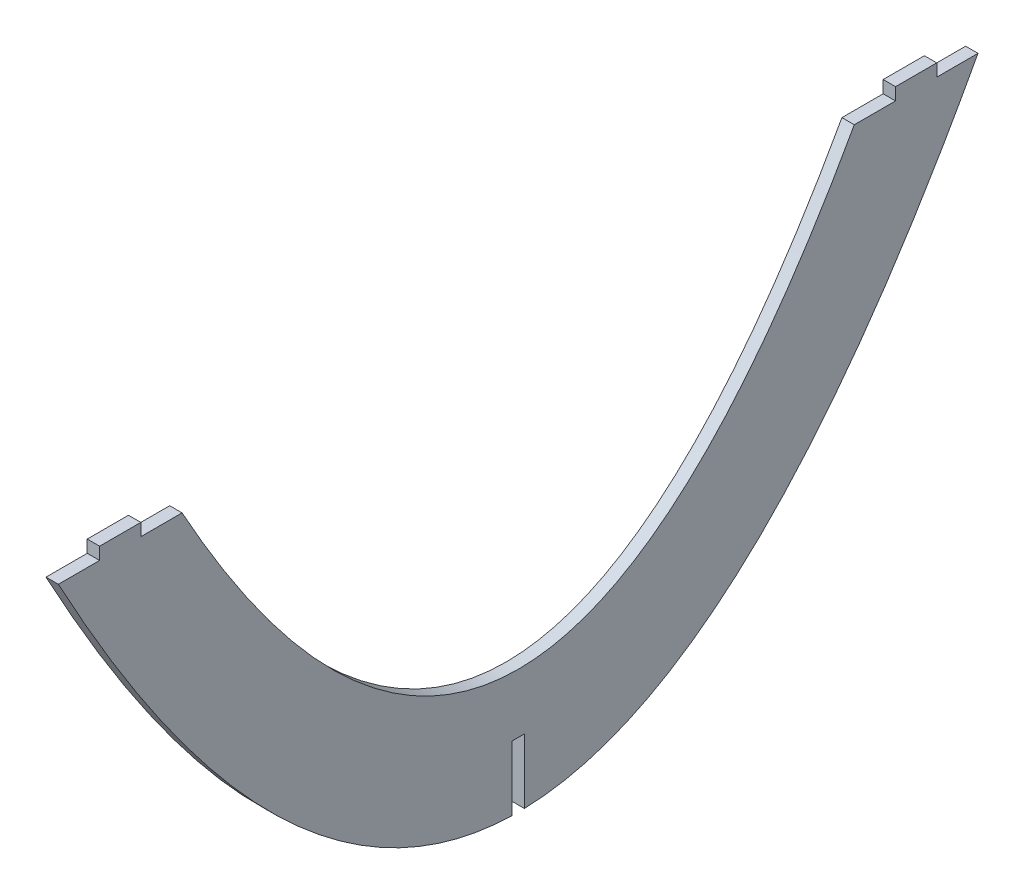
ISO-10303-21;
HEADER;
FILE_DESCRIPTION(('STEP AP214'),'2;1');
FILE_NAME('part.step','',(''),(''),'','','');
FILE_SCHEMA(('AUTOMOTIVE_DESIGN { 1 0 10303 214 1 1 1 1 }'));
ENDSEC;
DATA;
#1=APPLICATION_CONTEXT('core data for automotive mechanical design processes');
#2=APPLICATION_PROTOCOL_DEFINITION('international standard','automotive_design',2000,#1);
#3=PRODUCT_CONTEXT('',#1,'mechanical');
#4=PRODUCT('Part','Part','',(#3));
#5=PRODUCT_RELATED_PRODUCT_CATEGORY('part','',(#4));
#6=PRODUCT_DEFINITION_FORMATION('','',#4);
#7=PRODUCT_DEFINITION_CONTEXT('part definition',#1,'design');
#8=PRODUCT_DEFINITION('design','',#6,#7);
#9=PRODUCT_DEFINITION_SHAPE('','',#8);
#10=(LENGTH_UNIT() NAMED_UNIT(*) SI_UNIT(.MILLI.,.METRE.));
#11=(NAMED_UNIT(*) PLANE_ANGLE_UNIT() SI_UNIT($,.RADIAN.));
#12=(NAMED_UNIT(*) SI_UNIT($,.STERADIAN.) SOLID_ANGLE_UNIT());
#13=UNCERTAINTY_MEASURE_WITH_UNIT(LENGTH_MEASURE(1.E-05),#10,'distance_accuracy_value','');
#14=(GEOMETRIC_REPRESENTATION_CONTEXT(3) GLOBAL_UNCERTAINTY_ASSIGNED_CONTEXT((#13)) GLOBAL_UNIT_ASSIGNED_CONTEXT((#10,
#11,#12)) REPRESENTATION_CONTEXT('',''));
#15=CARTESIAN_POINT('',(0.,0.,0.));
#16=DIRECTION('',(0.,0.,1.));
#17=DIRECTION('',(1.,0.,0.));
#18=AXIS2_PLACEMENT_3D('',#15,#16,#17);
#19=CARTESIAN_POINT('',(3.,119.995854940723,111.512785800293));
#20=CARTESIAN_POINT('',(3.,-87.2475449406607,3.3356997719558E-11));
#21=CARTESIAN_POINT('',(3.,119.995854940599,-111.512785800226));
#22=B_SPLINE_CURVE_WITH_KNOTS('',2,(#19,#20,#21),.UNSPECIFIED.,.F.,.F.,(3,3),
(0.0571208681093189,0.942879131890416),.UNSPECIFIED.);
#23=DIRECTION('',(-1.,0.,0.));
#24=VECTOR('',#23,1.);
#25=SURFACE_OF_LINEAR_EXTRUSION('',#22,#24);
#26=DIRECTION('',(-1.,0.,0.));
#27=VECTOR('',#26,1.);
#28=CARTESIAN_POINT('',(3.,16.3929042500001,1.5000000000045));
#29=LINE('',#28,#27);
#30=CARTESIAN_POINT('',(3.,16.3929042500001,1.5000000000045));
#31=VERTEX_POINT('',#30);
#32=CARTESIAN_POINT('',(0.,16.3929042500001,1.5000000000045));
#33=VERTEX_POINT('',#32);
#34=EDGE_CURVE('E180',#31,#33,#29,.T.);
#35=ORIENTED_EDGE('',*,*,#34,.F.);
#36=CARTESIAN_POINT('',(3.,119.995854940654,111.512785800256));
#37=VERTEX_POINT('',#36);
#38=EDGE_CURVE('E171',#37,#31,#22,.T.);
#39=ORIENTED_EDGE('',*,*,#38,.F.);
#40=DIRECTION('',(-1.,0.,0.));
#41=VECTOR('',#40,1.);
#42=CARTESIAN_POINT('',(3.,119.995854940654,111.512785800256));
#43=LINE('',#42,#41);
#44=CARTESIAN_POINT('',(0.,119.995854940654,111.512785800256));
#45=VERTEX_POINT('',#44);
#46=EDGE_CURVE('E46',#37,#45,#43,.T.);
#47=ORIENTED_EDGE('',*,*,#46,.T.);
#48=CARTESIAN_POINT('',(0.,119.995854940723,111.512785800293));
#49=CARTESIAN_POINT('',(0.,-87.2475449406607,3.3356997719558E-11));
#50=CARTESIAN_POINT('',(0.,119.995854940599,-111.512785800226));
#51=B_SPLINE_CURVE_WITH_KNOTS('',2,(#48,#49,#50),.UNSPECIFIED.,.F.,.F.,(3,3),
(0.0571208681093189,0.942879131890416),.UNSPECIFIED.);
#52=EDGE_CURVE('E292',#45,#33,#51,.T.);
#53=ORIENTED_EDGE('',*,*,#52,.T.);
#54=EDGE_LOOP('',(#35,#39,#47,#53));
#55=FACE_BOUND('',#54,.T.);
#56=ADVANCED_FACE('F37',(#55),#25,.F.);
#57=CARTESIAN_POINT('',(3.,46.374155,-5.85226311855536E-11));
#58=DIRECTION('',(-1.,0.,0.));
#59=DIRECTION('',(0.,0.,1.));
#60=AXIS2_PLACEMENT_3D('',#57,#58,#59);
#61=PLANE('',#60);
#62=DIRECTION('',(0.,-1.,0.));
#63=VECTOR('',#62,1.);
#64=CARTESIAN_POINT('',(3.,0.,1.5000000000045));
#65=LINE('',#64,#63);
#66=CARTESIAN_POINT('',(3.,32.0685361496463,1.5000000000045));
#67=VERTEX_POINT('',#66);
#68=EDGE_CURVE('E163',#67,#31,#65,.T.);
#69=ORIENTED_EDGE('',*,*,#68,.F.);
#70=DIRECTION('',(0.,0.,1.));
#71=VECTOR('',#70,1.);
#72=CARTESIAN_POINT('',(3.,32.0685361496463,0.));
#73=LINE('',#72,#71);
#74=CARTESIAN_POINT('',(3.,32.0685361496463,-1.4999999999955));
#75=VERTEX_POINT('',#74);
#76=EDGE_CURVE('E152',#75,#67,#73,.T.);
#77=ORIENTED_EDGE('',*,*,#76,.F.);
#78=DIRECTION('',(0.,-1.,0.));
#79=VECTOR('',#78,1.);
#80=CARTESIAN_POINT('',(3.,0.,-1.4999999999955));
#81=LINE('',#80,#79);
#82=CARTESIAN_POINT('',(3.,16.3929042499999,-1.4999999999955));
#83=VERTEX_POINT('',#82);
#84=EDGE_CURVE('E162',#75,#83,#81,.T.);
#85=ORIENTED_EDGE('',*,*,#84,.T.);
#86=CARTESIAN_POINT('',(3.,119.995854940599,-111.512785800226));
#87=VERTEX_POINT('',#86);
#88=EDGE_CURVE('E252',#83,#87,#22,.T.);
#89=ORIENTED_EDGE('',*,*,#88,.T.);
#90=DIRECTION('',(0.,0.,1.));
#91=VECTOR('',#90,1.);
#92=CARTESIAN_POINT('',(3.,119.995854940654,-81.5104896311429));
#93=LINE('',#92,#91);
#94=CARTESIAN_POINT('',(3.,119.995854940654,-101.511637715685));
#95=VERTEX_POINT('',#94);
#96=EDGE_CURVE('E258',#87,#95,#93,.T.);
#97=ORIENTED_EDGE('',*,*,#96,.T.);
#98=DIRECTION('',(0.,-1.,0.));
#99=VECTOR('',#98,1.);
#100=CARTESIAN_POINT('',(3.,122.995854940654,-101.511637715685));
#101=LINE('',#100,#99);
#102=CARTESIAN_POINT('',(3.,122.995854940654,-101.511637715685));
#103=VERTEX_POINT('',#102);
#104=EDGE_CURVE('E230',#103,#95,#101,.T.);
#105=ORIENTED_EDGE('',*,*,#104,.F.);
#106=DIRECTION('',(0.,0.,-1.));
#107=VECTOR('',#106,1.);
#108=CARTESIAN_POINT('',(3.,122.995854940654,0.));
#109=LINE('',#108,#107);
#110=CARTESIAN_POINT('',(3.,122.995854940654,-91.5116377156847));
#111=VERTEX_POINT('',#110);
#112=EDGE_CURVE('E219',#111,#103,#109,.T.);
#113=ORIENTED_EDGE('',*,*,#112,.F.);
#114=DIRECTION('',(0.,-1.,0.));
#115=VECTOR('',#114,1.);
#116=CARTESIAN_POINT('',(3.,122.995854940654,-91.5116377156847));
#117=LINE('',#116,#115);
#118=CARTESIAN_POINT('',(3.,119.995854940654,-91.5116377156847));
#119=VERTEX_POINT('',#118);
#120=EDGE_CURVE('E233',#111,#119,#117,.T.);
#121=ORIENTED_EDGE('',*,*,#120,.T.);
#122=CARTESIAN_POINT('',(3.,119.995854940654,-81.5104896311429));
#123=VERTEX_POINT('',#122);
#124=EDGE_CURVE('E257',#119,#123,#93,.T.);
#125=ORIENTED_EDGE('',*,*,#124,.T.);
#126=CARTESIAN_POINT('',(3.,119.995854940618,-81.5104896311227));
#127=CARTESIAN_POINT('',(3.,-27.247544940513,-5.85365089733614E-11));
#128=CARTESIAN_POINT('',(3.,119.995854940408,81.5104896310056));
#129=B_SPLINE_CURVE_WITH_KNOTS('',2,(#126,#127,#128),.UNSPECIFIED.,.F.,.F.,(3,3),
(0.173392056409923,0.826607943590546),.UNSPECIFIED.);
#130=CARTESIAN_POINT('',(3.,119.995854940654,81.510489631142));
#131=VERTEX_POINT('',#130);
#132=EDGE_CURVE('E239',#123,#131,#129,.T.);
#133=ORIENTED_EDGE('',*,*,#132,.T.);
#134=DIRECTION('',(0.,0.,1.));
#135=VECTOR('',#134,1.);
#136=CARTESIAN_POINT('',(3.,119.995854940654,111.512785800256));
#137=LINE('',#136,#135);
#138=CARTESIAN_POINT('',(3.,119.995854940654,91.5116377156994));
#139=VERTEX_POINT('',#138);
#140=EDGE_CURVE('E246',#131,#139,#137,.T.);
#141=ORIENTED_EDGE('',*,*,#140,.T.);
#142=DIRECTION('',(0.,-1.,0.));
#143=VECTOR('',#142,1.);
#144=CARTESIAN_POINT('',(3.,122.995854940654,91.5116377156994));
#145=LINE('',#144,#143);
#146=CARTESIAN_POINT('',(3.,122.995854940654,91.5116377156994));
#147=VERTEX_POINT('',#146);
#148=EDGE_CURVE('E206',#147,#139,#145,.T.);
#149=ORIENTED_EDGE('',*,*,#148,.F.);
#150=DIRECTION('',(0.,0.,-1.));
#151=VECTOR('',#150,1.);
#152=CARTESIAN_POINT('',(3.,122.995854940654,0.));
#153=LINE('',#152,#151);
#154=CARTESIAN_POINT('',(3.,122.995854940654,101.511637715699));
#155=VERTEX_POINT('',#154);
#156=EDGE_CURVE('E190',#155,#147,#153,.T.);
#157=ORIENTED_EDGE('',*,*,#156,.F.);
#158=DIRECTION('',(0.,-1.,0.));
#159=VECTOR('',#158,1.);
#160=CARTESIAN_POINT('',(3.,122.995854940654,101.511637715699));
#161=LINE('',#160,#159);
#162=CARTESIAN_POINT('',(3.,119.995854940654,101.511637715699));
#163=VERTEX_POINT('',#162);
#164=EDGE_CURVE('E209',#155,#163,#161,.T.);
#165=ORIENTED_EDGE('',*,*,#164,.T.);
#166=EDGE_CURVE('E61',#163,#37,#137,.T.);
#167=ORIENTED_EDGE('',*,*,#166,.T.);
#168=ORIENTED_EDGE('',*,*,#38,.T.);
#169=EDGE_LOOP('',(#69,#77,#85,#89,#97,#105,#113,#121,#125,#133,#141,#149,#157,#165,#167,#168));
#170=FACE_BOUND('',#169,.T.);
#171=ADVANCED_FACE('F169',(#170),#61,.F.);
#172=CARTESIAN_POINT('',(0.,46.374155,-5.85226311855536E-11));
#173=DIRECTION('',(-1.,0.,0.));
#174=DIRECTION('',(0.,0.,1.));
#175=AXIS2_PLACEMENT_3D('',#172,#173,#174);
#176=PLANE('',#175);
#177=DIRECTION('',(0.,0.,1.));
#178=VECTOR('',#177,1.);
#179=CARTESIAN_POINT('',(0.,32.0685361496463,0.));
#180=LINE('',#179,#178);
#181=CARTESIAN_POINT('',(0.,32.0685361496463,-1.4999999999955));
#182=VERTEX_POINT('',#181);
#183=CARTESIAN_POINT('',(0.,32.0685361496463,1.5000000000045));
#184=VERTEX_POINT('',#183);
#185=EDGE_CURVE('E174',#182,#184,#180,.T.);
#186=ORIENTED_EDGE('',*,*,#185,.T.);
#187=DIRECTION('',(0.,-1.,0.));
#188=VECTOR('',#187,1.);
#189=CARTESIAN_POINT('',(0.,0.,1.5000000000045));
#190=LINE('',#189,#188);
#191=EDGE_CURVE('E53',#184,#33,#190,.T.);
#192=ORIENTED_EDGE('',*,*,#191,.T.);
#193=ORIENTED_EDGE('',*,*,#52,.F.);
#194=DIRECTION('',(0.,0.,1.));
#195=VECTOR('',#194,1.);
#196=CARTESIAN_POINT('',(0.,119.995854940654,111.512785800256));
#197=LINE('',#196,#195);
#198=CARTESIAN_POINT('',(0.,119.995854940654,101.511637715699));
#199=VERTEX_POINT('',#198);
#200=EDGE_CURVE('E344',#199,#45,#197,.T.);
#201=ORIENTED_EDGE('',*,*,#200,.F.);
#202=DIRECTION('',(0.,-1.,0.));
#203=VECTOR('',#202,1.);
#204=CARTESIAN_POINT('',(0.,122.995854940654,101.511637715699));
#205=LINE('',#204,#203);
#206=CARTESIAN_POINT('',(0.,122.995854940654,101.511637715699));
#207=VERTEX_POINT('',#206);
#208=EDGE_CURVE('E197',#207,#199,#205,.T.);
#209=ORIENTED_EDGE('',*,*,#208,.F.);
#210=DIRECTION('',(0.,0.,1.));
#211=VECTOR('',#210,1.);
#212=CARTESIAN_POINT('',(0.,122.995854940654,0.));
#213=LINE('',#212,#211);
#214=CARTESIAN_POINT('',(0.,122.995854940654,91.5116377156994));
#215=VERTEX_POINT('',#214);
#216=EDGE_CURVE('E195',#215,#207,#213,.T.);
#217=ORIENTED_EDGE('',*,*,#216,.F.);
#218=DIRECTION('',(0.,-1.,0.));
#219=VECTOR('',#218,1.);
#220=CARTESIAN_POINT('',(0.,122.995854940654,91.5116377156994));
#221=LINE('',#220,#219);
#222=CARTESIAN_POINT('',(0.,119.995854940654,91.5116377156994));
#223=VERTEX_POINT('',#222);
#224=EDGE_CURVE('E203',#215,#223,#221,.T.);
#225=ORIENTED_EDGE('',*,*,#224,.T.);
#226=CARTESIAN_POINT('',(0.,119.995854940654,81.510489631142));
#227=VERTEX_POINT('',#226);
#228=EDGE_CURVE('E345',#227,#223,#197,.T.);
#229=ORIENTED_EDGE('',*,*,#228,.F.);
#230=CARTESIAN_POINT('',(0.,119.995854940618,-81.5104896311227));
#231=CARTESIAN_POINT('',(0.,-27.247544940513,-5.85365089733614E-11));
#232=CARTESIAN_POINT('',(0.,119.995854940408,81.5104896310056));
#233=B_SPLINE_CURVE_WITH_KNOTS('',2,(#230,#231,#232),.UNSPECIFIED.,.F.,.F.,(3,3),
(0.173392056409923,0.826607943590546),.UNSPECIFIED.);
#234=CARTESIAN_POINT('',(0.,119.995854940654,-81.5104896311429));
#235=VERTEX_POINT('',#234);
#236=EDGE_CURVE('E238',#235,#227,#233,.T.);
#237=ORIENTED_EDGE('',*,*,#236,.F.);
#238=DIRECTION('',(0.,0.,1.));
#239=VECTOR('',#238,1.);
#240=CARTESIAN_POINT('',(0.,119.995854940654,-81.5104896311429));
#241=LINE('',#240,#239);
#242=CARTESIAN_POINT('',(0.,119.995854940654,-91.5116377156847));
#243=VERTEX_POINT('',#242);
#244=EDGE_CURVE('E323',#243,#235,#241,.T.);
#245=ORIENTED_EDGE('',*,*,#244,.F.);
#246=DIRECTION('',(0.,-1.,0.));
#247=VECTOR('',#246,1.);
#248=CARTESIAN_POINT('',(0.,122.995854940654,-91.5116377156847));
#249=LINE('',#248,#247);
#250=CARTESIAN_POINT('',(0.,122.995854940654,-91.5116377156847));
#251=VERTEX_POINT('',#250);
#252=EDGE_CURVE('E236',#251,#243,#249,.T.);
#253=ORIENTED_EDGE('',*,*,#252,.F.);
#254=DIRECTION('',(0.,0.,-1.));
#255=VECTOR('',#254,1.);
#256=CARTESIAN_POINT('',(0.,122.995854940654,0.));
#257=LINE('',#256,#255);
#258=CARTESIAN_POINT('',(0.,122.995854940654,-101.511637715685));
#259=VERTEX_POINT('',#258);
#260=EDGE_CURVE('E212',#251,#259,#257,.T.);
#261=ORIENTED_EDGE('',*,*,#260,.T.);
#262=DIRECTION('',(0.,-1.,0.));
#263=VECTOR('',#262,1.);
#264=CARTESIAN_POINT('',(0.,122.995854940654,-101.511637715685));
#265=LINE('',#264,#263);
#266=CARTESIAN_POINT('',(0.,119.995854940654,-101.511637715685));
#267=VERTEX_POINT('',#266);
#268=EDGE_CURVE('E223',#259,#267,#265,.T.);
#269=ORIENTED_EDGE('',*,*,#268,.T.);
#270=CARTESIAN_POINT('',(0.,119.995854940599,-111.512785800226));
#271=VERTEX_POINT('',#270);
#272=EDGE_CURVE('E245',#271,#267,#241,.T.);
#273=ORIENTED_EDGE('',*,*,#272,.F.);
#274=CARTESIAN_POINT('',(0.,16.3929042499999,-1.4999999999955));
#275=VERTEX_POINT('',#274);
#276=EDGE_CURVE('E297',#275,#271,#51,.T.);
#277=ORIENTED_EDGE('',*,*,#276,.F.);
#278=DIRECTION('',(0.,-1.,0.));
#279=VECTOR('',#278,1.);
#280=CARTESIAN_POINT('',(0.,0.,-1.4999999999955));
#281=LINE('',#280,#279);
#282=EDGE_CURVE('E172',#182,#275,#281,.T.);
#283=ORIENTED_EDGE('',*,*,#282,.F.);
#284=EDGE_LOOP('',(#186,#192,#193,#201,#209,#217,#225,#229,#237,#245,#253,#261,#269,#273,#277,#283));
#285=FACE_BOUND('',#284,.T.);
#286=ADVANCED_FACE('F280',(#285),#176,.T.);
#287=CARTESIAN_POINT('',(3.,119.995854940654,111.512785800256));
#288=DIRECTION('',(0.,-1.,0.));
#289=DIRECTION('',(0.,0.,-1.));
#290=AXIS2_PLACEMENT_3D('',#287,#288,#289);
#291=PLANE('',#290);
#292=DIRECTION('',(-1.,0.,0.));
#293=VECTOR('',#292,1.);
#294=CARTESIAN_POINT('',(4.23326363387589E-13,119.995854940654,91.5116377156994));
#295=LINE('',#294,#293);
#296=EDGE_CURVE('E191',#139,#223,#295,.T.);
#297=ORIENTED_EDGE('',*,*,#296,.F.);
#298=ORIENTED_EDGE('',*,*,#140,.F.);
#299=DIRECTION('',(-1.,0.,0.));
#300=VECTOR('',#299,1.);
#301=CARTESIAN_POINT('',(3.,119.995854940654,81.510489631142));
#302=LINE('',#301,#300);
#303=EDGE_CURVE('E11',#131,#227,#302,.T.);
#304=ORIENTED_EDGE('',*,*,#303,.T.);
#305=ORIENTED_EDGE('',*,*,#228,.T.);
#306=EDGE_LOOP('',(#297,#298,#304,#305));
#307=FACE_BOUND('',#306,.T.);
#308=ADVANCED_FACE('F272',(#307),#291,.F.);
#309=CARTESIAN_POINT('',(3.,119.995854940654,-81.5104896311429));
#310=DIRECTION('',(0.,-1.,0.));
#311=DIRECTION('',(0.,0.,-1.));
#312=AXIS2_PLACEMENT_3D('',#309,#310,#311);
#313=PLANE('',#312);
#314=DIRECTION('',(-1.,0.,0.));
#315=VECTOR('',#314,1.);
#316=CARTESIAN_POINT('',(0.,119.995854940654,-101.511637715685));
#317=LINE('',#316,#315);
#318=EDGE_CURVE('E216',#95,#267,#317,.T.);
#319=ORIENTED_EDGE('',*,*,#318,.F.);
#320=ORIENTED_EDGE('',*,*,#96,.F.);
#321=DIRECTION('',(-1.,0.,0.));
#322=VECTOR('',#321,1.);
#323=CARTESIAN_POINT('',(3.,119.995854940599,-111.512785800226));
#324=LINE('',#323,#322);
#325=EDGE_CURVE('E303',#87,#271,#324,.T.);
#326=ORIENTED_EDGE('',*,*,#325,.T.);
#327=ORIENTED_EDGE('',*,*,#272,.T.);
#328=EDGE_LOOP('',(#319,#320,#326,#327));
#329=FACE_BOUND('',#328,.T.);
#330=ADVANCED_FACE('F277',(#329),#313,.F.);
#331=DIRECTION('',(-1.,0.,0.));
#332=VECTOR('',#331,1.);
#333=SURFACE_OF_LINEAR_EXTRUSION('',#129,#332);
#334=ORIENTED_EDGE('',*,*,#236,.T.);
#335=ORIENTED_EDGE('',*,*,#303,.F.);
#336=ORIENTED_EDGE('',*,*,#132,.F.);
#337=DIRECTION('',(-1.,0.,0.));
#338=VECTOR('',#337,1.);
#339=CARTESIAN_POINT('',(3.,119.995854940654,-81.5104896311429));
#340=LINE('',#339,#338);
#341=EDGE_CURVE('E310',#123,#235,#340,.T.);
#342=ORIENTED_EDGE('',*,*,#341,.T.);
#343=EDGE_LOOP('',(#334,#335,#336,#342));
#344=FACE_BOUND('',#343,.T.);
#345=ADVANCED_FACE('F39',(#344),#333,.F.);
#346=ORIENTED_EDGE('',*,*,#166,.F.);
#347=DIRECTION('',(-1.,0.,0.));
#348=VECTOR('',#347,1.);
#349=CARTESIAN_POINT('',(0.,119.995854940654,101.511637715699));
#350=LINE('',#349,#348);
#351=EDGE_CURVE('E182',#163,#199,#350,.T.);
#352=ORIENTED_EDGE('',*,*,#351,.T.);
#353=ORIENTED_EDGE('',*,*,#200,.T.);
#354=ORIENTED_EDGE('',*,*,#46,.F.);
#355=EDGE_LOOP('',(#346,#352,#353,#354));
#356=FACE_BOUND('',#355,.T.);
#357=ADVANCED_FACE('F268',(#356),#291,.F.);
#358=ORIENTED_EDGE('',*,*,#88,.F.);
#359=DIRECTION('',(-1.,0.,0.));
#360=VECTOR('',#359,1.);
#361=CARTESIAN_POINT('',(3.,16.3929042499999,-1.4999999999955));
#362=LINE('',#361,#360);
#363=EDGE_CURVE('E183',#83,#275,#362,.T.);
#364=ORIENTED_EDGE('',*,*,#363,.T.);
#365=ORIENTED_EDGE('',*,*,#276,.T.);
#366=ORIENTED_EDGE('',*,*,#325,.F.);
#367=EDGE_LOOP('',(#358,#364,#365,#366));
#368=FACE_BOUND('',#367,.T.);
#369=ADVANCED_FACE('F264',(#368),#25,.F.);
#370=ORIENTED_EDGE('',*,*,#124,.F.);
#371=DIRECTION('',(-1.,0.,0.));
#372=VECTOR('',#371,1.);
#373=CARTESIAN_POINT('',(-4.23326363387954E-13,119.995854940654,-91.5116377156847));
#374=LINE('',#373,#372);
#375=EDGE_CURVE('E211',#119,#243,#374,.T.);
#376=ORIENTED_EDGE('',*,*,#375,.T.);
#377=ORIENTED_EDGE('',*,*,#244,.T.);
#378=ORIENTED_EDGE('',*,*,#341,.F.);
#379=EDGE_LOOP('',(#370,#376,#377,#378));
#380=FACE_BOUND('',#379,.T.);
#381=ADVANCED_FACE('F267',(#380),#313,.F.);
#382=CARTESIAN_POINT('',(-4.23326363387954E-13,122.995854940654,-91.5116377156847));
#383=DIRECTION('',(0.,0.,1.));
#384=DIRECTION('',(1.,0.,0.));
#385=AXIS2_PLACEMENT_3D('',#382,#383,#384);
#386=PLANE('',#385);
#387=ORIENTED_EDGE('',*,*,#375,.F.);
#388=ORIENTED_EDGE('',*,*,#120,.F.);
#389=DIRECTION('',(-1.,0.,0.));
#390=VECTOR('',#389,1.);
#391=CARTESIAN_POINT('',(-4.23326363387954E-13,122.995854940654,-91.5116377156847));
#392=LINE('',#391,#390);
#393=EDGE_CURVE('E215',#111,#251,#392,.T.);
#394=ORIENTED_EDGE('',*,*,#393,.T.);
#395=ORIENTED_EDGE('',*,*,#252,.T.);
#396=EDGE_LOOP('',(#387,#388,#394,#395));
#397=FACE_BOUND('',#396,.T.);
#398=ADVANCED_FACE('F321',(#397),#386,.T.);
#399=CARTESIAN_POINT('',(0.,122.995854940654,-101.511637715685));
#400=DIRECTION('',(0.,0.,1.));
#401=DIRECTION('',(0.,-1.,0.));
#402=AXIS2_PLACEMENT_3D('',#399,#400,#401);
#403=PLANE('',#402);
#404=ORIENTED_EDGE('',*,*,#318,.T.);
#405=ORIENTED_EDGE('',*,*,#268,.F.);
#406=DIRECTION('',(-1.,0.,0.));
#407=VECTOR('',#406,1.);
#408=CARTESIAN_POINT('',(0.,122.995854940654,-101.511637715685));
#409=LINE('',#408,#407);
#410=EDGE_CURVE('E221',#103,#259,#409,.T.);
#411=ORIENTED_EDGE('',*,*,#410,.F.);
#412=ORIENTED_EDGE('',*,*,#104,.T.);
#413=EDGE_LOOP('',(#404,#405,#411,#412));
#414=FACE_BOUND('',#413,.T.);
#415=ADVANCED_FACE('F312',(#414),#403,.F.);
#416=CARTESIAN_POINT('',(0.,122.995854940654,0.));
#417=DIRECTION('',(0.,1.,0.));
#418=DIRECTION('',(0.,0.,1.));
#419=AXIS2_PLACEMENT_3D('',#416,#417,#418);
#420=PLANE('',#419);
#421=ORIENTED_EDGE('',*,*,#260,.F.);
#422=ORIENTED_EDGE('',*,*,#393,.F.);
#423=ORIENTED_EDGE('',*,*,#112,.T.);
#424=ORIENTED_EDGE('',*,*,#410,.T.);
#425=EDGE_LOOP('',(#421,#422,#423,#424));
#426=FACE_BOUND('',#425,.T.);
#427=ADVANCED_FACE('F316',(#426),#420,.T.);
#428=CARTESIAN_POINT('',(0.,122.995854940654,101.511637715699));
#429=DIRECTION('',(0.,0.,1.));
#430=DIRECTION('',(0.,-1.,0.));
#431=AXIS2_PLACEMENT_3D('',#428,#429,#430);
#432=PLANE('',#431);
#433=ORIENTED_EDGE('',*,*,#351,.F.);
#434=ORIENTED_EDGE('',*,*,#164,.F.);
#435=DIRECTION('',(-1.,0.,0.));
#436=VECTOR('',#435,1.);
#437=CARTESIAN_POINT('',(0.,122.995854940654,101.511637715699));
#438=LINE('',#437,#436);
#439=EDGE_CURVE('E187',#155,#207,#438,.T.);
#440=ORIENTED_EDGE('',*,*,#439,.T.);
#441=ORIENTED_EDGE('',*,*,#208,.T.);
#442=EDGE_LOOP('',(#433,#434,#440,#441));
#443=FACE_BOUND('',#442,.T.);
#444=ADVANCED_FACE('F343',(#443),#432,.T.);
#445=CARTESIAN_POINT('',(4.23326363387589E-13,122.995854940654,91.5116377156994));
#446=DIRECTION('',(0.,0.,1.));
#447=DIRECTION('',(1.,0.,0.));
#448=AXIS2_PLACEMENT_3D('',#445,#446,#447);
#449=PLANE('',#448);
#450=ORIENTED_EDGE('',*,*,#296,.T.);
#451=ORIENTED_EDGE('',*,*,#224,.F.);
#452=DIRECTION('',(-1.,0.,0.));
#453=VECTOR('',#452,1.);
#454=CARTESIAN_POINT('',(4.23326363387589E-13,122.995854940654,91.5116377156994));
#455=LINE('',#454,#453);
#456=EDGE_CURVE('E193',#147,#215,#455,.T.);
#457=ORIENTED_EDGE('',*,*,#456,.F.);
#458=ORIENTED_EDGE('',*,*,#148,.T.);
#459=EDGE_LOOP('',(#450,#451,#457,#458));
#460=FACE_BOUND('',#459,.T.);
#461=ADVANCED_FACE('F334',(#460),#449,.F.);
#462=CARTESIAN_POINT('',(0.,122.995854940654,0.));
#463=DIRECTION('',(0.,1.,0.));
#464=DIRECTION('',(0.,0.,1.));
#465=AXIS2_PLACEMENT_3D('',#462,#463,#464);
#466=PLANE('',#465);
#467=ORIENTED_EDGE('',*,*,#439,.F.);
#468=ORIENTED_EDGE('',*,*,#156,.T.);
#469=ORIENTED_EDGE('',*,*,#456,.T.);
#470=ORIENTED_EDGE('',*,*,#216,.T.);
#471=EDGE_LOOP('',(#467,#468,#469,#470));
#472=FACE_BOUND('',#471,.T.);
#473=ADVANCED_FACE('F339',(#472),#466,.T.);
#474=CARTESIAN_POINT('',(3.,0.,1.5000000000045));
#475=DIRECTION('',(0.,0.,-1.));
#476=DIRECTION('',(0.,1.,0.));
#477=AXIS2_PLACEMENT_3D('',#474,#475,#476);
#478=PLANE('',#477);
#479=ORIENTED_EDGE('',*,*,#191,.F.);
#480=DIRECTION('',(-1.,0.,0.));
#481=VECTOR('',#480,1.);
#482=CARTESIAN_POINT('',(3.,32.0685361496463,1.5000000000045));
#483=LINE('',#482,#481);
#484=EDGE_CURVE('E155',#67,#184,#483,.T.);
#485=ORIENTED_EDGE('',*,*,#484,.F.);
#486=ORIENTED_EDGE('',*,*,#68,.T.);
#487=ORIENTED_EDGE('',*,*,#34,.T.);
#488=EDGE_LOOP('',(#479,#485,#486,#487));
#489=FACE_BOUND('',#488,.T.);
#490=ADVANCED_FACE('F165',(#489),#478,.T.);
#491=CARTESIAN_POINT('',(3.,0.,-1.4999999999955));
#492=DIRECTION('',(0.,0.,-1.));
#493=DIRECTION('',(-1.,0.,0.));
#494=AXIS2_PLACEMENT_3D('',#491,#492,#493);
#495=PLANE('',#494);
#496=ORIENTED_EDGE('',*,*,#282,.T.);
#497=ORIENTED_EDGE('',*,*,#363,.F.);
#498=ORIENTED_EDGE('',*,*,#84,.F.);
#499=DIRECTION('',(-1.,0.,0.));
#500=VECTOR('',#499,1.);
#501=CARTESIAN_POINT('',(3.,32.0685361496463,-1.4999999999955));
#502=LINE('',#501,#500);
#503=EDGE_CURVE('E157',#75,#182,#502,.T.);
#504=ORIENTED_EDGE('',*,*,#503,.T.);
#505=EDGE_LOOP('',(#496,#497,#498,#504));
#506=FACE_BOUND('',#505,.T.);
#507=ADVANCED_FACE('F299',(#506),#495,.F.);
#508=CARTESIAN_POINT('',(3.,32.0685361496463,0.));
#509=DIRECTION('',(0.,-1.,0.));
#510=DIRECTION('',(0.,0.,-1.));
#511=AXIS2_PLACEMENT_3D('',#508,#509,#510);
#512=PLANE('',#511);
#513=ORIENTED_EDGE('',*,*,#185,.F.);
#514=ORIENTED_EDGE('',*,*,#503,.F.);
#515=ORIENTED_EDGE('',*,*,#76,.T.);
#516=ORIENTED_EDGE('',*,*,#484,.T.);
#517=EDGE_LOOP('',(#513,#514,#515,#516));
#518=FACE_BOUND('',#517,.T.);
#519=ADVANCED_FACE('F154',(#518),#512,.T.);
#520=CLOSED_SHELL('',(#56,#171,#286,#308,#330,#345,#357,#369,#381,#398,#415,#427,#444,#461,#473,
#490,#507,#519));
#521=MANIFOLD_SOLID_BREP('B2',#520);
#522=ADVANCED_BREP_SHAPE_REPRESENTATION('',(#18,#521),#14);
#523=SHAPE_DEFINITION_REPRESENTATION(#9,#522);
ENDSEC;
END-ISO-10303-21;
